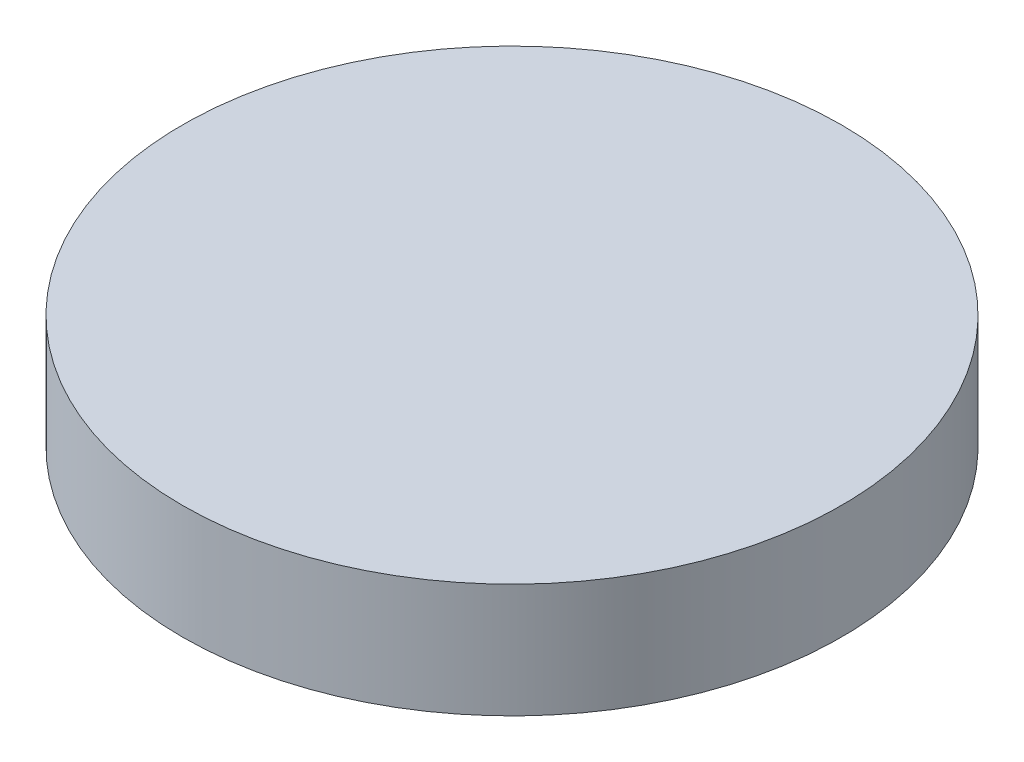
ISO-10303-21;
HEADER;
FILE_DESCRIPTION(('STEP AP214'),'2;1');
FILE_NAME('part.step','',(''),(''),'','','');
FILE_SCHEMA(('AUTOMOTIVE_DESIGN { 1 0 10303 214 1 1 1 1 }'));
ENDSEC;
DATA;
#1=APPLICATION_CONTEXT('core data for automotive mechanical design processes');
#2=APPLICATION_PROTOCOL_DEFINITION('international standard','automotive_design',2000,#1);
#3=PRODUCT_CONTEXT('',#1,'mechanical');
#4=PRODUCT('Part','Part','',(#3));
#5=PRODUCT_RELATED_PRODUCT_CATEGORY('part','',(#4));
#6=PRODUCT_DEFINITION_FORMATION('','',#4);
#7=PRODUCT_DEFINITION_CONTEXT('part definition',#1,'design');
#8=PRODUCT_DEFINITION('design','',#6,#7);
#9=PRODUCT_DEFINITION_SHAPE('','',#8);
#10=(LENGTH_UNIT() NAMED_UNIT(*) SI_UNIT(.MILLI.,.METRE.));
#11=(NAMED_UNIT(*) PLANE_ANGLE_UNIT() SI_UNIT($,.RADIAN.));
#12=(NAMED_UNIT(*) SI_UNIT($,.STERADIAN.) SOLID_ANGLE_UNIT());
#13=UNCERTAINTY_MEASURE_WITH_UNIT(LENGTH_MEASURE(1.E-05),#10,'distance_accuracy_value','');
#14=(GEOMETRIC_REPRESENTATION_CONTEXT(3) GLOBAL_UNCERTAINTY_ASSIGNED_CONTEXT((#13)) GLOBAL_UNIT_ASSIGNED_CONTEXT((#10,
#11,#12)) REPRESENTATION_CONTEXT('',''));
#15=CARTESIAN_POINT('',(0.,0.,0.));
#16=DIRECTION('',(0.,0.,1.));
#17=DIRECTION('',(1.,0.,0.));
#18=AXIS2_PLACEMENT_3D('',#15,#16,#17);
#19=CARTESIAN_POINT('',(0.,125.,0.));
#20=DIRECTION('',(0.,1.,0.));
#21=DIRECTION('',(0.,0.,1.));
#22=AXIS2_PLACEMENT_3D('',#19,#20,#21);
#23=PLANE('',#22);
#24=CARTESIAN_POINT('',(0.,125.,0.));
#25=DIRECTION('',(0.,-1.,0.));
#26=DIRECTION('',(0.,0.,-1.));
#27=AXIS2_PLACEMENT_3D('',#24,#25,#26);
#28=CIRCLE('',#27,650.);
#29=CARTESIAN_POINT('',(0.,125.,-650.));
#30=VERTEX_POINT('',#29);
#31=EDGE_CURVE('E10',#30,#30,#28,.T.);
#32=ORIENTED_EDGE('',*,*,#31,.F.);
#33=EDGE_LOOP('',(#32));
#34=FACE_BOUND('',#33,.T.);
#35=ADVANCED_FACE('F41',(#34),#23,.T.);
#36=CARTESIAN_POINT('',(0.,-100.,0.));
#37=DIRECTION('',(0.,-1.,0.));
#38=DIRECTION('',(0.,0.,-1.));
#39=AXIS2_PLACEMENT_3D('',#36,#37,#38);
#40=CYLINDRICAL_SURFACE('',#39,650.);
#41=ORIENTED_EDGE('',*,*,#31,.T.);
#42=EDGE_LOOP('',(#41));
#43=FACE_BOUND('',#42,.T.);
#44=CARTESIAN_POINT('',(0.,-100.,0.));
#45=DIRECTION('',(0.,-1.,0.));
#46=DIRECTION('',(0.,0.,-1.));
#47=AXIS2_PLACEMENT_3D('',#44,#45,#46);
#48=CIRCLE('',#47,650.);
#49=CARTESIAN_POINT('',(0.,-100.,-650.));
#50=VERTEX_POINT('',#49);
#51=EDGE_CURVE('E48',#50,#50,#48,.T.);
#52=ORIENTED_EDGE('',*,*,#51,.F.);
#53=EDGE_LOOP('',(#52));
#54=FACE_BOUND('',#53,.T.);
#55=ADVANCED_FACE('F57',(#43,#54),#40,.T.);
#56=CARTESIAN_POINT('',(0.,-100.,0.));
#57=DIRECTION('',(0.,-1.,0.));
#58=DIRECTION('',(0.,0.,-1.));
#59=AXIS2_PLACEMENT_3D('',#56,#57,#58);
#60=PLANE('',#59);
#61=ORIENTED_EDGE('',*,*,#51,.T.);
#62=EDGE_LOOP('',(#61));
#63=FACE_BOUND('',#62,.T.);
#64=ADVANCED_FACE('F55',(#63),#60,.T.);
#65=CLOSED_SHELL('',(#35,#55,#64));
#66=MANIFOLD_SOLID_BREP('B2',#65);
#67=ADVANCED_BREP_SHAPE_REPRESENTATION('',(#18,#66),#14);
#68=SHAPE_DEFINITION_REPRESENTATION(#9,#67);
ENDSEC;
END-ISO-10303-21;
